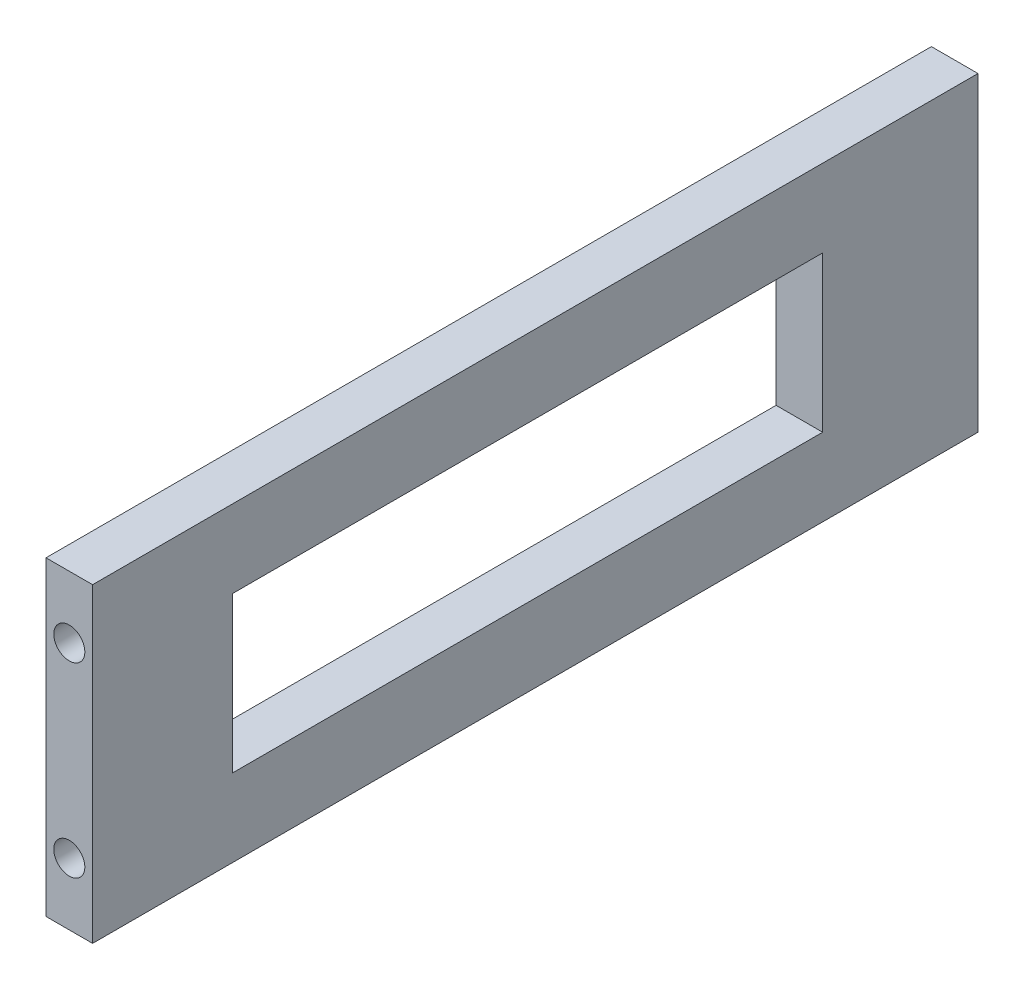
ISO-10303-21;
HEADER;
FILE_DESCRIPTION(('STEP AP214'),'2;1');
FILE_NAME('part.step','',(''),(''),'','','');
FILE_SCHEMA(('AUTOMOTIVE_DESIGN { 1 0 10303 214 1 1 1 1 }'));
ENDSEC;
DATA;
#1=APPLICATION_CONTEXT('core data for automotive mechanical design processes');
#2=APPLICATION_PROTOCOL_DEFINITION('international standard','automotive_design',2000,#1);
#3=PRODUCT_CONTEXT('',#1,'mechanical');
#4=PRODUCT('Part','Part','',(#3));
#5=PRODUCT_RELATED_PRODUCT_CATEGORY('part','',(#4));
#6=PRODUCT_DEFINITION_FORMATION('','',#4);
#7=PRODUCT_DEFINITION_CONTEXT('part definition',#1,'design');
#8=PRODUCT_DEFINITION('design','',#6,#7);
#9=PRODUCT_DEFINITION_SHAPE('','',#8);
#10=(LENGTH_UNIT() NAMED_UNIT(*) SI_UNIT(.MILLI.,.METRE.));
#11=(NAMED_UNIT(*) PLANE_ANGLE_UNIT() SI_UNIT($,.RADIAN.));
#12=(NAMED_UNIT(*) SI_UNIT($,.STERADIAN.) SOLID_ANGLE_UNIT());
#13=UNCERTAINTY_MEASURE_WITH_UNIT(LENGTH_MEASURE(1.E-05),#10,'distance_accuracy_value','');
#14=(GEOMETRIC_REPRESENTATION_CONTEXT(3) GLOBAL_UNCERTAINTY_ASSIGNED_CONTEXT((#13)) GLOBAL_UNIT_ASSIGNED_CONTEXT((#10,
#11,#12)) REPRESENTATION_CONTEXT('',''));
#15=CARTESIAN_POINT('',(0.,0.,0.));
#16=DIRECTION('',(0.,0.,1.));
#17=DIRECTION('',(1.,0.,0.));
#18=AXIS2_PLACEMENT_3D('',#15,#16,#17);
#19=CARTESIAN_POINT('',(3.,8.,14.0014));
#20=DIRECTION('',(0.,0.,1.));
#21=DIRECTION('',(1.,0.,0.));
#22=AXIS2_PLACEMENT_3D('',#19,#20,#21);
#23=PLANE('',#22);
#24=CARTESIAN_POINT('',(3.,8.,14.0014));
#25=DIRECTION('',(0.,0.,1.));
#26=DIRECTION('',(1.,0.,0.));
#27=AXIS2_PLACEMENT_3D('',#24,#25,#26);
#28=CIRCLE('',#27,2.);
#29=CARTESIAN_POINT('',(5.,8.,14.0014));
#30=VERTEX_POINT('',#29);
#31=EDGE_CURVE('E19',#30,#30,#28,.F.);
#32=ORIENTED_EDGE('',*,*,#31,.T.);
#33=EDGE_LOOP('',(#32));
#34=FACE_BOUND('',#33,.T.);
#35=ADVANCED_FACE('F16',(#34),#23,.F.);
#36=CARTESIAN_POINT('',(3.,32.,14.0014));
#37=DIRECTION('',(0.,0.,1.));
#38=DIRECTION('',(1.,0.,0.));
#39=AXIS2_PLACEMENT_3D('',#36,#37,#38);
#40=PLANE('',#39);
#41=CARTESIAN_POINT('',(3.,32.,14.0014));
#42=DIRECTION('',(0.,0.,1.));
#43=DIRECTION('',(1.,0.,0.));
#44=AXIS2_PLACEMENT_3D('',#41,#42,#43);
#45=CIRCLE('',#44,2.);
#46=CARTESIAN_POINT('',(5.,32.,14.0014));
#47=VERTEX_POINT('',#46);
#48=EDGE_CURVE('E126',#47,#47,#45,.F.);
#49=ORIENTED_EDGE('',*,*,#48,.T.);
#50=EDGE_LOOP('',(#49));
#51=FACE_BOUND('',#50,.T.);
#52=ADVANCED_FACE('F204',(#51),#40,.F.);
#53=CARTESIAN_POINT('',(3.,8.,100.0014));
#54=DIRECTION('',(0.,0.,-1.));
#55=DIRECTION('',(-1.,0.,0.));
#56=AXIS2_PLACEMENT_3D('',#53,#54,#55);
#57=PLANE('',#56);
#58=CARTESIAN_POINT('',(3.,8.,100.0014));
#59=DIRECTION('',(0.,0.,-1.));
#60=DIRECTION('',(-1.,0.,0.));
#61=AXIS2_PLACEMENT_3D('',#58,#59,#60);
#62=CIRCLE('',#61,2.);
#63=CARTESIAN_POINT('',(1.,8.,100.0014));
#64=VERTEX_POINT('',#63);
#65=EDGE_CURVE('E124',#64,#64,#62,.F.);
#66=ORIENTED_EDGE('',*,*,#65,.T.);
#67=EDGE_LOOP('',(#66));
#68=FACE_BOUND('',#67,.T.);
#69=ADVANCED_FACE('F148',(#68),#57,.F.);
#70=CARTESIAN_POINT('',(3.,32.,100.0014));
#71=DIRECTION('',(0.,0.,-1.));
#72=DIRECTION('',(-1.,0.,0.));
#73=AXIS2_PLACEMENT_3D('',#70,#71,#72);
#74=PLANE('',#73);
#75=CARTESIAN_POINT('',(3.,32.,100.0014));
#76=DIRECTION('',(0.,0.,-1.));
#77=DIRECTION('',(-1.,0.,0.));
#78=AXIS2_PLACEMENT_3D('',#75,#76,#77);
#79=CIRCLE('',#78,2.);
#80=CARTESIAN_POINT('',(1.,32.,100.0014));
#81=VERTEX_POINT('',#80);
#82=EDGE_CURVE('E97',#81,#81,#79,.F.);
#83=ORIENTED_EDGE('',*,*,#82,.T.);
#84=EDGE_LOOP('',(#83));
#85=FACE_BOUND('',#84,.T.);
#86=ADVANCED_FACE('F137',(#85),#74,.F.);
#87=CARTESIAN_POINT('',(3.,8.,0.00139999999999));
#88=DIRECTION('',(0.,0.,1.));
#89=DIRECTION('',(1.,0.,0.));
#90=AXIS2_PLACEMENT_3D('',#87,#88,#89);
#91=CYLINDRICAL_SURFACE('',#90,2.);
#92=CARTESIAN_POINT('',(3.,8.,0.00139999999999));
#93=DIRECTION('',(0.,0.,1.));
#94=DIRECTION('',(1.,0.,0.));
#95=AXIS2_PLACEMENT_3D('',#92,#93,#94);
#96=CIRCLE('',#95,2.);
#97=CARTESIAN_POINT('',(5.,8.,0.00139999999999));
#98=VERTEX_POINT('',#97);
#99=EDGE_CURVE('E103',#98,#98,#96,.F.);
#100=ORIENTED_EDGE('',*,*,#99,.T.);
#101=EDGE_LOOP('',(#100));
#102=FACE_BOUND('',#101,.T.);
#103=ORIENTED_EDGE('',*,*,#31,.F.);
#104=EDGE_LOOP('',(#103));
#105=FACE_BOUND('',#104,.T.);
#106=ADVANCED_FACE('F134',(#102,#105),#91,.F.);
#107=CARTESIAN_POINT('',(3.,32.,0.00139999999999));
#108=DIRECTION('',(0.,0.,1.));
#109=DIRECTION('',(1.,0.,0.));
#110=AXIS2_PLACEMENT_3D('',#107,#108,#109);
#111=CYLINDRICAL_SURFACE('',#110,2.);
#112=CARTESIAN_POINT('',(3.,32.,0.00139999999999));
#113=DIRECTION('',(0.,0.,1.));
#114=DIRECTION('',(1.,0.,0.));
#115=AXIS2_PLACEMENT_3D('',#112,#113,#114);
#116=CIRCLE('',#115,2.);
#117=CARTESIAN_POINT('',(5.,32.,0.00139999999999));
#118=VERTEX_POINT('',#117);
#119=EDGE_CURVE('E106',#118,#118,#116,.F.);
#120=ORIENTED_EDGE('',*,*,#119,.T.);
#121=EDGE_LOOP('',(#120));
#122=FACE_BOUND('',#121,.T.);
#123=ORIENTED_EDGE('',*,*,#48,.F.);
#124=EDGE_LOOP('',(#123));
#125=FACE_BOUND('',#124,.T.);
#126=ADVANCED_FACE('F136',(#122,#125),#111,.F.);
#127=CARTESIAN_POINT('',(3.,8.,114.0014));
#128=DIRECTION('',(0.,0.,-1.));
#129=DIRECTION('',(-1.,0.,0.));
#130=AXIS2_PLACEMENT_3D('',#127,#128,#129);
#131=CYLINDRICAL_SURFACE('',#130,2.);
#132=CARTESIAN_POINT('',(3.,8.,114.0014));
#133=DIRECTION('',(0.,0.,-1.));
#134=DIRECTION('',(-1.,0.,0.));
#135=AXIS2_PLACEMENT_3D('',#132,#133,#134);
#136=CIRCLE('',#135,2.);
#137=CARTESIAN_POINT('',(1.,8.,114.0014));
#138=VERTEX_POINT('',#137);
#139=EDGE_CURVE('E116',#138,#138,#136,.T.);
#140=ORIENTED_EDGE('',*,*,#139,.F.);
#141=EDGE_LOOP('',(#140));
#142=FACE_BOUND('',#141,.T.);
#143=ORIENTED_EDGE('',*,*,#65,.F.);
#144=EDGE_LOOP('',(#143));
#145=FACE_BOUND('',#144,.T.);
#146=ADVANCED_FACE('F145',(#142,#145),#131,.F.);
#147=CARTESIAN_POINT('',(3.,32.,114.0014));
#148=DIRECTION('',(0.,0.,-1.));
#149=DIRECTION('',(-1.,0.,0.));
#150=AXIS2_PLACEMENT_3D('',#147,#148,#149);
#151=CYLINDRICAL_SURFACE('',#150,2.);
#152=CARTESIAN_POINT('',(3.,32.,114.0014));
#153=DIRECTION('',(0.,0.,-1.));
#154=DIRECTION('',(-1.,0.,0.));
#155=AXIS2_PLACEMENT_3D('',#152,#153,#154);
#156=CIRCLE('',#155,2.);
#157=CARTESIAN_POINT('',(1.,32.,114.0014));
#158=VERTEX_POINT('',#157);
#159=EDGE_CURVE('E112',#158,#158,#156,.T.);
#160=ORIENTED_EDGE('',*,*,#159,.F.);
#161=EDGE_LOOP('',(#160));
#162=FACE_BOUND('',#161,.T.);
#163=ORIENTED_EDGE('',*,*,#82,.F.);
#164=EDGE_LOOP('',(#163));
#165=FACE_BOUND('',#164,.T.);
#166=ADVANCED_FACE('F190',(#162,#165),#151,.F.);
#167=CARTESIAN_POINT('',(0.,0.,0.00139999999999));
#168=DIRECTION('',(1.,0.,0.));
#169=DIRECTION('',(0.,0.,-1.));
#170=AXIS2_PLACEMENT_3D('',#167,#168,#169);
#171=PLANE('',#170);
#172=DIRECTION('',(0.,0.,1.));
#173=VECTOR('',#172,1.);
#174=CARTESIAN_POINT('',(0.,30.,20.0014));
#175=LINE('',#174,#173);
#176=CARTESIAN_POINT('',(0.,30.,20.0014));
#177=VERTEX_POINT('',#176);
#178=CARTESIAN_POINT('',(0.,30.,96.0014));
#179=VERTEX_POINT('',#178);
#180=EDGE_CURVE('E343',#177,#179,#175,.T.);
#181=ORIENTED_EDGE('',*,*,#180,.T.);
#182=DIRECTION('',(0.,1.,0.));
#183=VECTOR('',#182,1.);
#184=CARTESIAN_POINT('',(0.,10.,96.0014));
#185=LINE('',#184,#183);
#186=CARTESIAN_POINT('',(0.,10.,96.0014));
#187=VERTEX_POINT('',#186);
#188=EDGE_CURVE('E347',#179,#187,#185,.F.);
#189=ORIENTED_EDGE('',*,*,#188,.T.);
#190=DIRECTION('',(0.,0.,1.));
#191=VECTOR('',#190,1.);
#192=CARTESIAN_POINT('',(0.,10.,20.0014));
#193=LINE('',#192,#191);
#194=CARTESIAN_POINT('',(0.,10.,20.0014));
#195=VERTEX_POINT('',#194);
#196=EDGE_CURVE('E115',#195,#187,#193,.T.);
#197=ORIENTED_EDGE('',*,*,#196,.F.);
#198=DIRECTION('',(0.,1.,0.));
#199=VECTOR('',#198,1.);
#200=CARTESIAN_POINT('',(0.,10.,20.0014));
#201=LINE('',#200,#199);
#202=EDGE_CURVE('E338',#177,#195,#201,.F.);
#203=ORIENTED_EDGE('',*,*,#202,.F.);
#204=EDGE_LOOP('',(#181,#189,#197,#203));
#205=FACE_BOUND('',#204,.T.);
#206=DIRECTION('',(0.,0.,1.));
#207=VECTOR('',#206,1.);
#208=CARTESIAN_POINT('',(0.,40.,0.00139999999999));
#209=LINE('',#208,#207);
#210=CARTESIAN_POINT('',(0.,40.,0.00139999999999));
#211=VERTEX_POINT('',#210);
#212=CARTESIAN_POINT('',(0.,40.,114.0014));
#213=VERTEX_POINT('',#212);
#214=EDGE_CURVE('E87',#211,#213,#209,.T.);
#215=ORIENTED_EDGE('',*,*,#214,.F.);
#216=DIRECTION('',(0.,1.,0.));
#217=VECTOR('',#216,1.);
#218=CARTESIAN_POINT('',(0.,0.,0.00139999999999));
#219=LINE('',#218,#217);
#220=CARTESIAN_POINT('',(0.,0.,0.00139999999999));
#221=VERTEX_POINT('',#220);
#222=EDGE_CURVE('E79',#211,#221,#219,.F.);
#223=ORIENTED_EDGE('',*,*,#222,.T.);
#224=DIRECTION('',(0.,0.,1.));
#225=VECTOR('',#224,1.);
#226=CARTESIAN_POINT('',(0.,0.,0.00139999999999));
#227=LINE('',#226,#225);
#228=CARTESIAN_POINT('',(0.,0.,114.0014));
#229=VERTEX_POINT('',#228);
#230=EDGE_CURVE('E84',#221,#229,#227,.T.);
#231=ORIENTED_EDGE('',*,*,#230,.T.);
#232=DIRECTION('',(0.,1.,0.));
#233=VECTOR('',#232,1.);
#234=CARTESIAN_POINT('',(0.,0.,114.0014));
#235=LINE('',#234,#233);
#236=EDGE_CURVE('E353',#213,#229,#235,.F.);
#237=ORIENTED_EDGE('',*,*,#236,.F.);
#238=EDGE_LOOP('',(#215,#223,#231,#237));
#239=FACE_BOUND('',#238,.T.);
#240=ADVANCED_FACE('F83',(#205,#239),#171,.F.);
#241=CARTESIAN_POINT('',(0.,0.,0.00139999999999));
#242=DIRECTION('',(0.,1.,0.));
#243=DIRECTION('',(0.,0.,1.));
#244=AXIS2_PLACEMENT_3D('',#241,#242,#243);
#245=PLANE('',#244);
#246=DIRECTION('',(1.,0.,0.));
#247=VECTOR('',#246,1.);
#248=CARTESIAN_POINT('',(0.,0.,114.0014));
#249=LINE('',#248,#247);
#250=CARTESIAN_POINT('',(6.,0.,114.0014));
#251=VERTEX_POINT('',#250);
#252=EDGE_CURVE('E95',#229,#251,#249,.T.);
#253=ORIENTED_EDGE('',*,*,#252,.F.);
#254=ORIENTED_EDGE('',*,*,#230,.F.);
#255=DIRECTION('',(1.,0.,0.));
#256=VECTOR('',#255,1.);
#257=CARTESIAN_POINT('',(0.,0.,0.00139999999999));
#258=LINE('',#257,#256);
#259=CARTESIAN_POINT('',(6.,0.,0.00139999999999));
#260=VERTEX_POINT('',#259);
#261=EDGE_CURVE('E89',#221,#260,#258,.T.);
#262=ORIENTED_EDGE('',*,*,#261,.T.);
#263=DIRECTION('',(0.,0.,-1.));
#264=VECTOR('',#263,1.);
#265=CARTESIAN_POINT('',(6.,0.,0.00139999999999));
#266=LINE('',#265,#264);
#267=EDGE_CURVE('E329',#251,#260,#266,.T.);
#268=ORIENTED_EDGE('',*,*,#267,.F.);
#269=EDGE_LOOP('',(#253,#254,#262,#268));
#270=FACE_BOUND('',#269,.T.);
#271=ADVANCED_FACE('F92',(#270),#245,.F.);
#272=CARTESIAN_POINT('',(0.,0.,0.00139999999999));
#273=DIRECTION('',(0.,0.,1.));
#274=DIRECTION('',(1.,0.,0.));
#275=AXIS2_PLACEMENT_3D('',#272,#273,#274);
#276=PLANE('',#275);
#277=ORIENTED_EDGE('',*,*,#119,.F.);
#278=EDGE_LOOP('',(#277));
#279=FACE_BOUND('',#278,.T.);
#280=ORIENTED_EDGE('',*,*,#99,.F.);
#281=EDGE_LOOP('',(#280));
#282=FACE_BOUND('',#281,.T.);
#283=DIRECTION('',(0.,1.,0.));
#284=VECTOR('',#283,1.);
#285=CARTESIAN_POINT('',(6.,0.,0.00139999999999));
#286=LINE('',#285,#284);
#287=CARTESIAN_POINT('',(6.,40.,0.00139999999999));
#288=VERTEX_POINT('',#287);
#289=EDGE_CURVE('E101',#260,#288,#286,.T.);
#290=ORIENTED_EDGE('',*,*,#289,.F.);
#291=ORIENTED_EDGE('',*,*,#261,.F.);
#292=ORIENTED_EDGE('',*,*,#222,.F.);
#293=DIRECTION('',(1.,0.,0.));
#294=VECTOR('',#293,1.);
#295=CARTESIAN_POINT('',(0.,40.,0.00139999999999));
#296=LINE('',#295,#294);
#297=EDGE_CURVE('E109',#288,#211,#296,.F.);
#298=ORIENTED_EDGE('',*,*,#297,.F.);
#299=EDGE_LOOP('',(#290,#291,#292,#298));
#300=FACE_BOUND('',#299,.T.);
#301=ADVANCED_FACE('F99',(#279,#282,#300),#276,.F.);
#302=CARTESIAN_POINT('',(0.,40.,0.00139999999999));
#303=DIRECTION('',(0.,1.,0.));
#304=DIRECTION('',(0.,0.,1.));
#305=AXIS2_PLACEMENT_3D('',#302,#303,#304);
#306=PLANE('',#305);
#307=DIRECTION('',(1.,0.,0.));
#308=VECTOR('',#307,1.);
#309=CARTESIAN_POINT('',(0.,40.,114.0014));
#310=LINE('',#309,#308);
#311=CARTESIAN_POINT('',(6.,40.,114.0014));
#312=VERTEX_POINT('',#311);
#313=EDGE_CURVE('E119',#312,#213,#310,.F.);
#314=ORIENTED_EDGE('',*,*,#313,.F.);
#315=DIRECTION('',(0.,0.,-1.));
#316=VECTOR('',#315,1.);
#317=CARTESIAN_POINT('',(6.,40.,0.00139999999999));
#318=LINE('',#317,#316);
#319=EDGE_CURVE('E325',#288,#312,#318,.F.);
#320=ORIENTED_EDGE('',*,*,#319,.F.);
#321=ORIENTED_EDGE('',*,*,#297,.T.);
#322=ORIENTED_EDGE('',*,*,#214,.T.);
#323=EDGE_LOOP('',(#314,#320,#321,#322));
#324=FACE_BOUND('',#323,.T.);
#325=ADVANCED_FACE('F178',(#324),#306,.T.);
#326=CARTESIAN_POINT('',(0.,0.,114.0014));
#327=DIRECTION('',(0.,0.,1.));
#328=DIRECTION('',(1.,0.,0.));
#329=AXIS2_PLACEMENT_3D('',#326,#327,#328);
#330=PLANE('',#329);
#331=ORIENTED_EDGE('',*,*,#159,.T.);
#332=EDGE_LOOP('',(#331));
#333=FACE_BOUND('',#332,.T.);
#334=ORIENTED_EDGE('',*,*,#139,.T.);
#335=EDGE_LOOP('',(#334));
#336=FACE_BOUND('',#335,.T.);
#337=DIRECTION('',(0.,1.,0.));
#338=VECTOR('',#337,1.);
#339=CARTESIAN_POINT('',(6.,0.,114.0014));
#340=LINE('',#339,#338);
#341=EDGE_CURVE('E322',#312,#251,#340,.F.);
#342=ORIENTED_EDGE('',*,*,#341,.F.);
#343=ORIENTED_EDGE('',*,*,#313,.T.);
#344=ORIENTED_EDGE('',*,*,#236,.T.);
#345=ORIENTED_EDGE('',*,*,#252,.T.);
#346=EDGE_LOOP('',(#342,#343,#344,#345));
#347=FACE_BOUND('',#346,.T.);
#348=ADVANCED_FACE('F174',(#333,#336,#347),#330,.T.);
#349=CARTESIAN_POINT('',(0.,10.,20.0014));
#350=DIRECTION('',(0.,1.,0.));
#351=DIRECTION('',(0.,0.,1.));
#352=AXIS2_PLACEMENT_3D('',#349,#350,#351);
#353=PLANE('',#352);
#354=DIRECTION('',(1.,0.,0.));
#355=VECTOR('',#354,1.);
#356=CARTESIAN_POINT('',(0.,10.,96.0014));
#357=LINE('',#356,#355);
#358=CARTESIAN_POINT('',(6.,10.,96.0014));
#359=VERTEX_POINT('',#358);
#360=EDGE_CURVE('E345',#187,#359,#357,.T.);
#361=ORIENTED_EDGE('',*,*,#360,.T.);
#362=DIRECTION('',(0.,0.,-1.));
#363=VECTOR('',#362,1.);
#364=CARTESIAN_POINT('',(6.,10.,0.00139999999999));
#365=LINE('',#364,#363);
#366=CARTESIAN_POINT('',(6.,10.,20.0014));
#367=VERTEX_POINT('',#366);
#368=EDGE_CURVE('E324',#367,#359,#365,.F.);
#369=ORIENTED_EDGE('',*,*,#368,.F.);
#370=DIRECTION('',(1.,0.,0.));
#371=VECTOR('',#370,1.);
#372=CARTESIAN_POINT('',(0.,10.,20.0014));
#373=LINE('',#372,#371);
#374=EDGE_CURVE('E335',#195,#367,#373,.T.);
#375=ORIENTED_EDGE('',*,*,#374,.F.);
#376=ORIENTED_EDGE('',*,*,#196,.T.);
#377=EDGE_LOOP('',(#361,#369,#375,#376));
#378=FACE_BOUND('',#377,.T.);
#379=ADVANCED_FACE('F170',(#378),#353,.T.);
#380=CARTESIAN_POINT('',(0.,10.,96.0014));
#381=DIRECTION('',(0.,0.,1.));
#382=DIRECTION('',(1.,0.,0.));
#383=AXIS2_PLACEMENT_3D('',#380,#381,#382);
#384=PLANE('',#383);
#385=DIRECTION('',(0.,1.,0.));
#386=VECTOR('',#385,1.);
#387=CARTESIAN_POINT('',(6.,0.,96.0014));
#388=LINE('',#387,#386);
#389=CARTESIAN_POINT('',(6.,30.,96.0014));
#390=VERTEX_POINT('',#389);
#391=EDGE_CURVE('E360',#359,#390,#388,.T.);
#392=ORIENTED_EDGE('',*,*,#391,.F.);
#393=ORIENTED_EDGE('',*,*,#360,.F.);
#394=ORIENTED_EDGE('',*,*,#188,.F.);
#395=DIRECTION('',(1.,0.,0.));
#396=VECTOR('',#395,1.);
#397=CARTESIAN_POINT('',(0.,30.,96.0014));
#398=LINE('',#397,#396);
#399=EDGE_CURVE('E341',#179,#390,#398,.T.);
#400=ORIENTED_EDGE('',*,*,#399,.T.);
#401=EDGE_LOOP('',(#392,#393,#394,#400));
#402=FACE_BOUND('',#401,.T.);
#403=ADVANCED_FACE('F167',(#402),#384,.F.);
#404=CARTESIAN_POINT('',(0.,30.,20.0014));
#405=DIRECTION('',(0.,1.,0.));
#406=DIRECTION('',(0.,0.,1.));
#407=AXIS2_PLACEMENT_3D('',#404,#405,#406);
#408=PLANE('',#407);
#409=ORIENTED_EDGE('',*,*,#399,.F.);
#410=ORIENTED_EDGE('',*,*,#180,.F.);
#411=DIRECTION('',(1.,0.,0.));
#412=VECTOR('',#411,1.);
#413=CARTESIAN_POINT('',(0.,30.,20.0014));
#414=LINE('',#413,#412);
#415=CARTESIAN_POINT('',(6.,30.,20.0014));
#416=VERTEX_POINT('',#415);
#417=EDGE_CURVE('E34',#416,#177,#414,.F.);
#418=ORIENTED_EDGE('',*,*,#417,.F.);
#419=DIRECTION('',(0.,0.,-1.));
#420=VECTOR('',#419,1.);
#421=CARTESIAN_POINT('',(6.,30.,0.00139999999999));
#422=LINE('',#421,#420);
#423=EDGE_CURVE('E25',#390,#416,#422,.T.);
#424=ORIENTED_EDGE('',*,*,#423,.F.);
#425=EDGE_LOOP('',(#409,#410,#418,#424));
#426=FACE_BOUND('',#425,.T.);
#427=ADVANCED_FACE('F159',(#426),#408,.F.);
#428=CARTESIAN_POINT('',(0.,10.,20.0014));
#429=DIRECTION('',(0.,0.,1.));
#430=DIRECTION('',(1.,0.,0.));
#431=AXIS2_PLACEMENT_3D('',#428,#429,#430);
#432=PLANE('',#431);
#433=DIRECTION('',(0.,1.,0.));
#434=VECTOR('',#433,1.);
#435=CARTESIAN_POINT('',(6.,0.,20.0014));
#436=LINE('',#435,#434);
#437=EDGE_CURVE('E11',#416,#367,#436,.F.);
#438=ORIENTED_EDGE('',*,*,#437,.F.);
#439=ORIENTED_EDGE('',*,*,#417,.T.);
#440=ORIENTED_EDGE('',*,*,#202,.T.);
#441=ORIENTED_EDGE('',*,*,#374,.T.);
#442=EDGE_LOOP('',(#438,#439,#440,#441));
#443=FACE_BOUND('',#442,.T.);
#444=ADVANCED_FACE('F153',(#443),#432,.T.);
#445=CARTESIAN_POINT('',(6.,0.,0.00139999999999));
#446=DIRECTION('',(1.,0.,0.));
#447=DIRECTION('',(0.,0.,-1.));
#448=AXIS2_PLACEMENT_3D('',#445,#446,#447);
#449=PLANE('',#448);
#450=ORIENTED_EDGE('',*,*,#423,.T.);
#451=ORIENTED_EDGE('',*,*,#437,.T.);
#452=ORIENTED_EDGE('',*,*,#368,.T.);
#453=ORIENTED_EDGE('',*,*,#391,.T.);
#454=EDGE_LOOP('',(#450,#451,#452,#453));
#455=FACE_BOUND('',#454,.T.);
#456=ORIENTED_EDGE('',*,*,#319,.T.);
#457=ORIENTED_EDGE('',*,*,#341,.T.);
#458=ORIENTED_EDGE('',*,*,#267,.T.);
#459=ORIENTED_EDGE('',*,*,#289,.T.);
#460=EDGE_LOOP('',(#456,#457,#458,#459));
#461=FACE_BOUND('',#460,.T.);
#462=ADVANCED_FACE('F151',(#455,#461),#449,.T.);
#463=CLOSED_SHELL('',(#35,#52,#69,#86,#106,#126,#146,#166,#240,#271,#301,#325,#348,#379,#403,
#427,#444,#462));
#464=MANIFOLD_SOLID_BREP('B1',#463);
#465=ADVANCED_BREP_SHAPE_REPRESENTATION('',(#18,#464),#14);
#466=SHAPE_DEFINITION_REPRESENTATION(#9,#465);
ENDSEC;
END-ISO-10303-21;
